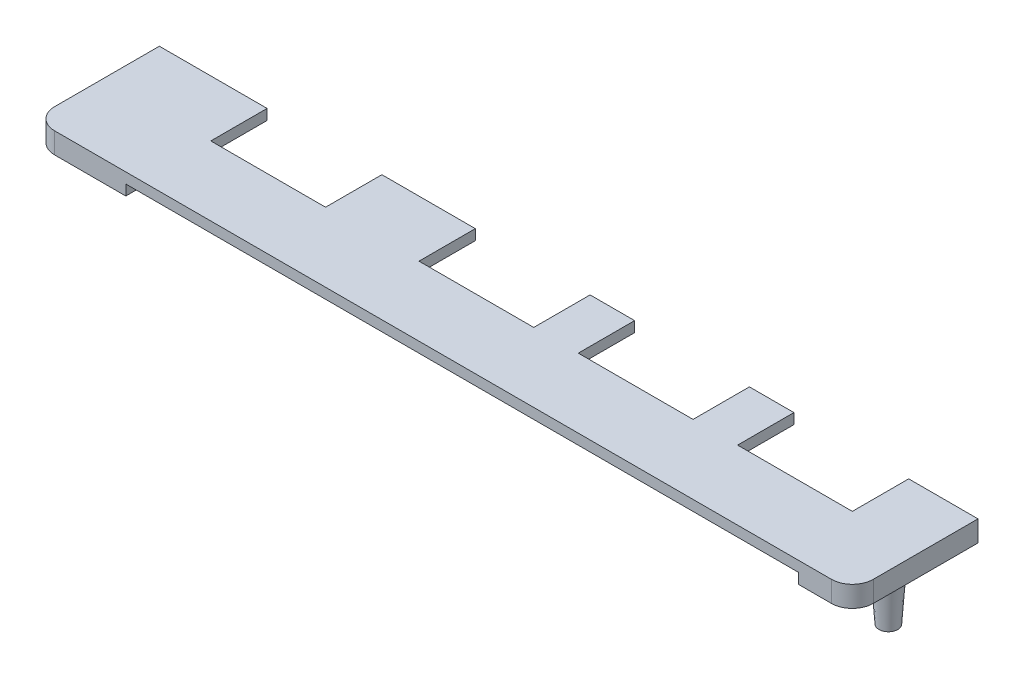
ISO-10303-21;
HEADER;
FILE_DESCRIPTION(('STEP AP214'),'2;1');
FILE_NAME('part.step','',(''),(''),'','','');
FILE_SCHEMA(('AUTOMOTIVE_DESIGN { 1 0 10303 214 1 1 1 1 }'));
ENDSEC;
DATA;
#1=APPLICATION_CONTEXT('core data for automotive mechanical design processes');
#2=APPLICATION_PROTOCOL_DEFINITION('international standard','automotive_design',2000,#1);
#3=PRODUCT_CONTEXT('',#1,'mechanical');
#4=PRODUCT('Part','Part','',(#3));
#5=PRODUCT_RELATED_PRODUCT_CATEGORY('part','',(#4));
#6=PRODUCT_DEFINITION_FORMATION('','',#4);
#7=PRODUCT_DEFINITION_CONTEXT('part definition',#1,'design');
#8=PRODUCT_DEFINITION('design','',#6,#7);
#9=PRODUCT_DEFINITION_SHAPE('','',#8);
#10=(LENGTH_UNIT() NAMED_UNIT(*) SI_UNIT(.MILLI.,.METRE.));
#11=(NAMED_UNIT(*) PLANE_ANGLE_UNIT() SI_UNIT($,.RADIAN.));
#12=(NAMED_UNIT(*) SI_UNIT($,.STERADIAN.) SOLID_ANGLE_UNIT());
#13=UNCERTAINTY_MEASURE_WITH_UNIT(LENGTH_MEASURE(1.E-05),#10,'distance_accuracy_value','');
#14=(GEOMETRIC_REPRESENTATION_CONTEXT(3) GLOBAL_UNCERTAINTY_ASSIGNED_CONTEXT((#13)) GLOBAL_UNIT_ASSIGNED_CONTEXT((#10,
#11,#12)) REPRESENTATION_CONTEXT('',''));
#15=CARTESIAN_POINT('',(0.,0.,0.));
#16=DIRECTION('',(0.,0.,1.));
#17=DIRECTION('',(1.,0.,0.));
#18=AXIS2_PLACEMENT_3D('',#15,#16,#17);
#19=CARTESIAN_POINT('',(0.,1.27,26.3271));
#20=DIRECTION('',(0.,0.,-1.));
#21=DIRECTION('',(-1.,0.,0.));
#22=AXIS2_PLACEMENT_3D('',#19,#20,#21);
#23=PLANE('',#22);
#24=DIRECTION('',(1.,0.,0.));
#25=VECTOR('',#24,1.);
#26=CARTESIAN_POINT('',(0.,0.,26.3271));
#27=LINE('',#26,#25);
#28=CARTESIAN_POINT('',(-36.6395000000001,0.,26.3271));
#29=VERTEX_POINT('',#28);
#30=CARTESIAN_POINT('',(-22.6949000000001,0.,26.3271));
#31=VERTEX_POINT('',#30);
#32=EDGE_CURVE('E310',#29,#31,#27,.T.);
#33=ORIENTED_EDGE('',*,*,#32,.F.);
#34=DIRECTION('',(0.,-1.,0.));
#35=VECTOR('',#34,1.);
#36=CARTESIAN_POINT('',(-36.6395000000001,1.27,26.3271));
#37=LINE('',#36,#35);
#38=CARTESIAN_POINT('',(-36.6395000000001,1.27,26.3271));
#39=VERTEX_POINT('',#38);
#40=EDGE_CURVE('E264',#39,#29,#37,.T.);
#41=ORIENTED_EDGE('',*,*,#40,.F.);
#42=DIRECTION('',(1.,0.,0.));
#43=VECTOR('',#42,1.);
#44=CARTESIAN_POINT('',(0.,1.27,26.3271));
#45=LINE('',#44,#43);
#46=CARTESIAN_POINT('',(-22.6949000000001,1.27,26.3271));
#47=VERTEX_POINT('',#46);
#48=EDGE_CURVE('E263',#39,#47,#45,.T.);
#49=ORIENTED_EDGE('',*,*,#48,.T.);
#50=DIRECTION('',(0.,-1.,0.));
#51=VECTOR('',#50,1.);
#52=CARTESIAN_POINT('',(-22.6949000000001,1.27,26.3271));
#53=LINE('',#52,#51);
#54=EDGE_CURVE('E260',#47,#31,#53,.T.);
#55=ORIENTED_EDGE('',*,*,#54,.T.);
#56=EDGE_LOOP('',(#33,#41,#49,#55));
#57=FACE_BOUND('',#56,.T.);
#58=ADVANCED_FACE('F34',(#57),#23,.T.);
#59=CARTESIAN_POINT('',(0.,1.27,26.3271));
#60=DIRECTION('',(0.,0.,-1.));
#61=DIRECTION('',(-1.,0.,0.));
#62=AXIS2_PLACEMENT_3D('',#59,#60,#61);
#63=PLANE('',#62);
#64=DIRECTION('',(1.,0.,0.));
#65=VECTOR('',#64,1.);
#66=CARTESIAN_POINT('',(0.,0.,26.3271));
#67=LINE('',#66,#65);
#68=CARTESIAN_POINT('',(-11.3411,0.,26.3271));
#69=VERTEX_POINT('',#68);
#70=CARTESIAN_POINT('',(2.60350000000001,0.,26.3271));
#71=VERTEX_POINT('',#70);
#72=EDGE_CURVE('E304',#69,#71,#67,.T.);
#73=ORIENTED_EDGE('',*,*,#72,.F.);
#74=DIRECTION('',(0.,-1.,0.));
#75=VECTOR('',#74,1.);
#76=CARTESIAN_POINT('',(-11.3411,1.27,26.3271));
#77=LINE('',#76,#75);
#78=CARTESIAN_POINT('',(-11.3411,1.27,26.3271));
#79=VERTEX_POINT('',#78);
#80=EDGE_CURVE('E272',#79,#69,#77,.T.);
#81=ORIENTED_EDGE('',*,*,#80,.F.);
#82=DIRECTION('',(1.,0.,0.));
#83=VECTOR('',#82,1.);
#84=CARTESIAN_POINT('',(0.,1.27,26.3271));
#85=LINE('',#84,#83);
#86=CARTESIAN_POINT('',(2.60350000000001,1.27,26.3271));
#87=VERTEX_POINT('',#86);
#88=EDGE_CURVE('E271',#79,#87,#85,.T.);
#89=ORIENTED_EDGE('',*,*,#88,.T.);
#90=DIRECTION('',(0.,-1.,0.));
#91=VECTOR('',#90,1.);
#92=CARTESIAN_POINT('',(2.60350000000001,1.27,26.3271));
#93=LINE('',#92,#91);
#94=EDGE_CURVE('E267',#87,#71,#93,.T.);
#95=ORIENTED_EDGE('',*,*,#94,.T.);
#96=EDGE_LOOP('',(#73,#81,#89,#95));
#97=FACE_BOUND('',#96,.T.);
#98=ADVANCED_FACE('F473',(#97),#63,.T.);
#99=CARTESIAN_POINT('',(0.,1.27,26.3271));
#100=DIRECTION('',(0.,0.,-1.));
#101=DIRECTION('',(-1.,0.,0.));
#102=AXIS2_PLACEMENT_3D('',#99,#100,#101);
#103=PLANE('',#102);
#104=DIRECTION('',(1.,0.,0.));
#105=VECTOR('',#104,1.);
#106=CARTESIAN_POINT('',(0.,0.,26.3271));
#107=LINE('',#106,#105);
#108=CARTESIAN_POINT('',(8.01369999999999,0.,26.3271));
#109=VERTEX_POINT('',#108);
#110=CARTESIAN_POINT('',(21.9583,0.,26.3271));
#111=VERTEX_POINT('',#110);
#112=EDGE_CURVE('E297',#109,#111,#107,.T.);
#113=ORIENTED_EDGE('',*,*,#112,.F.);
#114=DIRECTION('',(0.,-1.,0.));
#115=VECTOR('',#114,1.);
#116=CARTESIAN_POINT('',(8.01369999999999,1.27,26.3271));
#117=LINE('',#116,#115);
#118=CARTESIAN_POINT('',(8.01369999999999,1.27,26.3271));
#119=VERTEX_POINT('',#118);
#120=EDGE_CURVE('E281',#119,#109,#117,.T.);
#121=ORIENTED_EDGE('',*,*,#120,.F.);
#122=DIRECTION('',(1.,0.,0.));
#123=VECTOR('',#122,1.);
#124=CARTESIAN_POINT('',(0.,1.27,26.3271));
#125=LINE('',#124,#123);
#126=CARTESIAN_POINT('',(21.9583,1.27,26.3271));
#127=VERTEX_POINT('',#126);
#128=EDGE_CURVE('E280',#119,#127,#125,.T.);
#129=ORIENTED_EDGE('',*,*,#128,.T.);
#130=DIRECTION('',(0.,-1.,0.));
#131=VECTOR('',#130,1.);
#132=CARTESIAN_POINT('',(21.9583,1.27,26.3271));
#133=LINE('',#132,#131);
#134=EDGE_CURVE('E276',#127,#111,#133,.T.);
#135=ORIENTED_EDGE('',*,*,#134,.T.);
#136=EDGE_LOOP('',(#113,#121,#129,#135));
#137=FACE_BOUND('',#136,.T.);
#138=ADVANCED_FACE('F442',(#137),#103,.T.);
#139=CARTESIAN_POINT('',(0.,1.27,26.3271));
#140=DIRECTION('',(0.,0.,-1.));
#141=DIRECTION('',(-1.,0.,0.));
#142=AXIS2_PLACEMENT_3D('',#139,#140,#141);
#143=PLANE('',#142);
#144=DIRECTION('',(1.,0.,0.));
#145=VECTOR('',#144,1.);
#146=CARTESIAN_POINT('',(0.,0.,26.3271));
#147=LINE('',#146,#145);
#148=CARTESIAN_POINT('',(27.3685,0.,26.3271));
#149=VERTEX_POINT('',#148);
#150=CARTESIAN_POINT('',(41.3131,0.,26.3271));
#151=VERTEX_POINT('',#150);
#152=EDGE_CURVE('E296',#149,#151,#147,.T.);
#153=ORIENTED_EDGE('',*,*,#152,.F.);
#154=DIRECTION('',(0.,-1.,0.));
#155=VECTOR('',#154,1.);
#156=CARTESIAN_POINT('',(27.3685,1.27,26.3271));
#157=LINE('',#156,#155);
#158=CARTESIAN_POINT('',(27.3685,1.27,26.3271));
#159=VERTEX_POINT('',#158);
#160=EDGE_CURVE('E289',#159,#149,#157,.T.);
#161=ORIENTED_EDGE('',*,*,#160,.F.);
#162=DIRECTION('',(1.,0.,0.));
#163=VECTOR('',#162,1.);
#164=CARTESIAN_POINT('',(0.,1.27,26.3271));
#165=LINE('',#164,#163);
#166=CARTESIAN_POINT('',(41.3131,1.27,26.3271));
#167=VERTEX_POINT('',#166);
#168=EDGE_CURVE('E288',#159,#167,#165,.T.);
#169=ORIENTED_EDGE('',*,*,#168,.T.);
#170=DIRECTION('',(0.,-1.,0.));
#171=VECTOR('',#170,1.);
#172=CARTESIAN_POINT('',(41.3131,1.27,26.3271));
#173=LINE('',#172,#171);
#174=EDGE_CURVE('E284',#167,#151,#173,.T.);
#175=ORIENTED_EDGE('',*,*,#174,.T.);
#176=EDGE_LOOP('',(#153,#161,#169,#175));
#177=FACE_BOUND('',#176,.T.);
#178=ADVANCED_FACE('F500',(#177),#143,.T.);
#179=CARTESIAN_POINT('',(0.,1.27,34.7472));
#180=DIRECTION('',(0.,0.,-1.));
#181=DIRECTION('',(-1.,0.,0.));
#182=AXIS2_PLACEMENT_3D('',#179,#180,#181);
#183=PLANE('',#182);
#184=DIRECTION('',(-1.,0.,0.));
#185=VECTOR('',#184,1.);
#186=CARTESIAN_POINT('',(43.2181,-1.27,34.7472));
#187=LINE('',#186,#185);
#188=CARTESIAN_POINT('',(47.1932000000001,-1.27,34.7472));
#189=VERTEX_POINT('',#188);
#190=CARTESIAN_POINT('',(43.2181,-1.27,34.7472));
#191=VERTEX_POINT('',#190);
#192=EDGE_CURVE('E358',#189,#191,#187,.T.);
#193=ORIENTED_EDGE('',*,*,#192,.F.);
#194=DIRECTION('',(0.,-1.,0.));
#195=VECTOR('',#194,1.);
#196=CARTESIAN_POINT('',(47.1932000000001,1.27,34.7472));
#197=LINE('',#196,#195);
#198=CARTESIAN_POINT('',(47.1932000000001,1.27,34.7472));
#199=VERTEX_POINT('',#198);
#200=EDGE_CURVE('E381',#189,#199,#197,.F.);
#201=ORIENTED_EDGE('',*,*,#200,.T.);
#202=DIRECTION('',(1.,0.,0.));
#203=VECTOR('',#202,1.);
#204=CARTESIAN_POINT('',(0.,1.27,34.7472));
#205=LINE('',#204,#203);
#206=CARTESIAN_POINT('',(-47.1932,1.27,34.7472));
#207=VERTEX_POINT('',#206);
#208=EDGE_CURVE('E292',#207,#199,#205,.T.);
#209=ORIENTED_EDGE('',*,*,#208,.F.);
#210=DIRECTION('',(0.,-1.,0.));
#211=VECTOR('',#210,1.);
#212=CARTESIAN_POINT('',(-47.1932,-1.27,34.7472));
#213=LINE('',#212,#211);
#214=CARTESIAN_POINT('',(-47.1932,-1.27,34.7472));
#215=VERTEX_POINT('',#214);
#216=EDGE_CURVE('E378',#207,#215,#213,.T.);
#217=ORIENTED_EDGE('',*,*,#216,.T.);
#218=DIRECTION('',(-1.,0.,0.));
#219=VECTOR('',#218,1.);
#220=CARTESIAN_POINT('',(-49.7332,-1.27,34.7472));
#221=LINE('',#220,#219);
#222=CARTESIAN_POINT('',(-38.5445000000001,-1.27,34.7472));
#223=VERTEX_POINT('',#222);
#224=EDGE_CURVE('E209',#223,#215,#221,.T.);
#225=ORIENTED_EDGE('',*,*,#224,.F.);
#226=DIRECTION('',(0.,1.,0.));
#227=VECTOR('',#226,1.);
#228=CARTESIAN_POINT('',(-38.5445000000001,-1.27,34.7472));
#229=LINE('',#228,#227);
#230=CARTESIAN_POINT('',(-38.5445000000001,0.,34.7472));
#231=VERTEX_POINT('',#230);
#232=EDGE_CURVE('E270',#223,#231,#229,.T.);
#233=ORIENTED_EDGE('',*,*,#232,.T.);
#234=DIRECTION('',(1.,0.,0.));
#235=VECTOR('',#234,1.);
#236=CARTESIAN_POINT('',(0.,0.,34.7472));
#237=LINE('',#236,#235);
#238=CARTESIAN_POINT('',(43.2181,0.,34.7472));
#239=VERTEX_POINT('',#238);
#240=EDGE_CURVE('E314',#231,#239,#237,.T.);
#241=ORIENTED_EDGE('',*,*,#240,.T.);
#242=DIRECTION('',(0.,1.,0.));
#243=VECTOR('',#242,1.);
#244=CARTESIAN_POINT('',(43.2181,-1.27,34.7472));
#245=LINE('',#244,#243);
#246=EDGE_CURVE('E354',#191,#239,#245,.T.);
#247=ORIENTED_EDGE('',*,*,#246,.F.);
#248=EDGE_LOOP('',(#193,#201,#209,#217,#225,#233,#241,#247));
#249=FACE_BOUND('',#248,.T.);
#250=ADVANCED_FACE('F406',(#249),#183,.F.);
#251=CARTESIAN_POINT('',(0.,1.27,0.));
#252=DIRECTION('',(0.,1.,0.));
#253=DIRECTION('',(0.,0.,1.));
#254=AXIS2_PLACEMENT_3D('',#251,#252,#253);
#255=PLANE('',#254);
#256=ORIENTED_EDGE('',*,*,#208,.T.);
#257=CARTESIAN_POINT('',(47.1932000000001,1.27,32.2072));
#258=DIRECTION('',(0.,1.,0.));
#259=DIRECTION('',(0.,0.,1.));
#260=AXIS2_PLACEMENT_3D('',#257,#258,#259);
#261=CIRCLE('',#260,2.54);
#262=CARTESIAN_POINT('',(49.7332000000001,1.27,32.2072));
#263=VERTEX_POINT('',#262);
#264=EDGE_CURVE('E385',#199,#263,#261,.T.);
#265=ORIENTED_EDGE('',*,*,#264,.T.);
#266=DIRECTION('',(0.,0.,-1.));
#267=VECTOR('',#266,1.);
#268=CARTESIAN_POINT('',(49.7332000000001,1.27,0.));
#269=LINE('',#268,#267);
#270=CARTESIAN_POINT('',(49.7332000000001,1.27,19.4818));
#271=VERTEX_POINT('',#270);
#272=EDGE_CURVE('E343',#263,#271,#269,.T.);
#273=ORIENTED_EDGE('',*,*,#272,.T.);
#274=DIRECTION('',(1.,0.,0.));
#275=VECTOR('',#274,1.);
#276=CARTESIAN_POINT('',(-49.7332,1.27,19.4818));
#277=LINE('',#276,#275);
#278=CARTESIAN_POINT('',(41.3131,1.27,19.4818));
#279=VERTEX_POINT('',#278);
#280=EDGE_CURVE('E413',#279,#271,#277,.T.);
#281=ORIENTED_EDGE('',*,*,#280,.F.);
#282=DIRECTION('',(0.,0.,1.));
#283=VECTOR('',#282,1.);
#284=CARTESIAN_POINT('',(41.3131,1.27,0.));
#285=LINE('',#284,#283);
#286=EDGE_CURVE('E327',#279,#167,#285,.T.);
#287=ORIENTED_EDGE('',*,*,#286,.T.);
#288=ORIENTED_EDGE('',*,*,#168,.F.);
#289=DIRECTION('',(0.,0.,1.));
#290=VECTOR('',#289,1.);
#291=CARTESIAN_POINT('',(27.3685,1.27,0.));
#292=LINE('',#291,#290);
#293=CARTESIAN_POINT('',(27.3685,1.27,19.4818));
#294=VERTEX_POINT('',#293);
#295=EDGE_CURVE('E293',#294,#159,#292,.T.);
#296=ORIENTED_EDGE('',*,*,#295,.F.);
#297=CARTESIAN_POINT('',(21.9583,1.27,19.4818));
#298=VERTEX_POINT('',#297);
#299=EDGE_CURVE('E415',#298,#294,#277,.T.);
#300=ORIENTED_EDGE('',*,*,#299,.F.);
#301=DIRECTION('',(0.,0.,1.));
#302=VECTOR('',#301,1.);
#303=CARTESIAN_POINT('',(21.9583,1.27,0.));
#304=LINE('',#303,#302);
#305=EDGE_CURVE('E330',#298,#127,#304,.T.);
#306=ORIENTED_EDGE('',*,*,#305,.T.);
#307=ORIENTED_EDGE('',*,*,#128,.F.);
#308=DIRECTION('',(0.,0.,1.));
#309=VECTOR('',#308,1.);
#310=CARTESIAN_POINT('',(8.01369999999998,1.27,0.));
#311=LINE('',#310,#309);
#312=CARTESIAN_POINT('',(8.01369999999998,1.27,19.4818));
#313=VERTEX_POINT('',#312);
#314=EDGE_CURVE('E266',#313,#119,#311,.T.);
#315=ORIENTED_EDGE('',*,*,#314,.F.);
#316=CARTESIAN_POINT('',(2.60350000000001,1.27,19.4818));
#317=VERTEX_POINT('',#316);
#318=EDGE_CURVE('E417',#317,#313,#277,.T.);
#319=ORIENTED_EDGE('',*,*,#318,.F.);
#320=DIRECTION('',(0.,0.,1.));
#321=VECTOR('',#320,1.);
#322=CARTESIAN_POINT('',(2.6035,1.27,0.));
#323=LINE('',#322,#321);
#324=EDGE_CURVE('E335',#317,#87,#323,.T.);
#325=ORIENTED_EDGE('',*,*,#324,.T.);
#326=ORIENTED_EDGE('',*,*,#88,.F.);
#327=DIRECTION('',(0.,0.,1.));
#328=VECTOR('',#327,1.);
#329=CARTESIAN_POINT('',(-11.3411,1.27,0.));
#330=LINE('',#329,#328);
#331=CARTESIAN_POINT('',(-11.3411,1.27,19.4818));
#332=VERTEX_POINT('',#331);
#333=EDGE_CURVE('E275',#332,#79,#330,.T.);
#334=ORIENTED_EDGE('',*,*,#333,.F.);
#335=CARTESIAN_POINT('',(-22.6949000000001,1.27,19.4818));
#336=VERTEX_POINT('',#335);
#337=EDGE_CURVE('E421',#336,#332,#277,.T.);
#338=ORIENTED_EDGE('',*,*,#337,.F.);
#339=DIRECTION('',(0.,0.,-1.));
#340=VECTOR('',#339,1.);
#341=CARTESIAN_POINT('',(-22.6949000000001,1.27,0.));
#342=LINE('',#341,#340);
#343=EDGE_CURVE('E317',#47,#336,#342,.T.);
#344=ORIENTED_EDGE('',*,*,#343,.F.);
#345=ORIENTED_EDGE('',*,*,#48,.F.);
#346=DIRECTION('',(0.,0.,-1.));
#347=VECTOR('',#346,1.);
#348=CARTESIAN_POINT('',(-36.6395000000001,1.27,0.));
#349=LINE('',#348,#347);
#350=CARTESIAN_POINT('',(-36.6395000000001,1.27,19.4818));
#351=VERTEX_POINT('',#350);
#352=EDGE_CURVE('E340',#39,#351,#349,.T.);
#353=ORIENTED_EDGE('',*,*,#352,.T.);
#354=CARTESIAN_POINT('',(-49.7332,1.27,19.4818));
#355=VERTEX_POINT('',#354);
#356=EDGE_CURVE('E219',#355,#351,#277,.T.);
#357=ORIENTED_EDGE('',*,*,#356,.F.);
#358=DIRECTION('',(0.,0.,-1.));
#359=VECTOR('',#358,1.);
#360=CARTESIAN_POINT('',(-49.7332,1.27,0.));
#361=LINE('',#360,#359);
#362=CARTESIAN_POINT('',(-49.7332,1.27,32.2072));
#363=VERTEX_POINT('',#362);
#364=EDGE_CURVE('E222',#363,#355,#361,.T.);
#365=ORIENTED_EDGE('',*,*,#364,.F.);
#366=CARTESIAN_POINT('',(-47.1932,1.27,32.2072));
#367=DIRECTION('',(0.,1.,0.));
#368=DIRECTION('',(0.,0.,1.));
#369=AXIS2_PLACEMENT_3D('',#366,#367,#368);
#370=CIRCLE('',#369,2.54);
#371=EDGE_CURVE('E383',#363,#207,#370,.T.);
#372=ORIENTED_EDGE('',*,*,#371,.T.);
#373=EDGE_LOOP('',(#256,#265,#273,#281,#287,#288,#296,#300,#306,#307,#315,#319,#325,#326,#334,
#338,#344,#345,#353,#357,#365,#372));
#374=FACE_BOUND('',#373,.T.);
#375=ADVANCED_FACE('F389',(#374),#255,.T.);
#376=CARTESIAN_POINT('',(27.3685,1.27,0.));
#377=DIRECTION('',(1.,0.,0.));
#378=DIRECTION('',(0.,0.,-1.));
#379=AXIS2_PLACEMENT_3D('',#376,#377,#378);
#380=PLANE('',#379);
#381=DIRECTION('',(0.,-1.,0.));
#382=VECTOR('',#381,1.);
#383=CARTESIAN_POINT('',(27.3685,1.27,19.4818));
#384=LINE('',#383,#382);
#385=CARTESIAN_POINT('',(27.3685,0.,19.4818));
#386=VERTEX_POINT('',#385);
#387=EDGE_CURVE('E243',#294,#386,#384,.T.);
#388=ORIENTED_EDGE('',*,*,#387,.F.);
#389=ORIENTED_EDGE('',*,*,#295,.T.);
#390=ORIENTED_EDGE('',*,*,#160,.T.);
#391=DIRECTION('',(0.,0.,1.));
#392=VECTOR('',#391,1.);
#393=CARTESIAN_POINT('',(27.3685,0.,0.));
#394=LINE('',#393,#392);
#395=EDGE_CURVE('E294',#386,#149,#394,.T.);
#396=ORIENTED_EDGE('',*,*,#395,.F.);
#397=EDGE_LOOP('',(#388,#389,#390,#396));
#398=FACE_BOUND('',#397,.T.);
#399=ADVANCED_FACE('F505',(#398),#380,.T.);
#400=CARTESIAN_POINT('',(0.,-1.27,0.));
#401=DIRECTION('',(0.,-1.,0.));
#402=DIRECTION('',(0.,0.,-1.));
#403=AXIS2_PLACEMENT_3D('',#400,#401,#402);
#404=PLANE('',#403);
#405=CARTESIAN_POINT('',(-46.4756500000001,-1.27,27.1145));
#406=DIRECTION('',(0.,-1.,0.));
#407=DIRECTION('',(0.,0.,1.));
#408=AXIS2_PLACEMENT_3D('',#405,#406,#407);
#409=CIRCLE('',#408,1.5875);
#410=CARTESIAN_POINT('',(-46.4756500000001,-1.27,28.702));
#411=VERTEX_POINT('',#410);
#412=EDGE_CURVE('E776',#411,#411,#409,.T.);
#413=ORIENTED_EDGE('',*,*,#412,.F.);
#414=EDGE_LOOP('',(#413));
#415=FACE_BOUND('',#414,.T.);
#416=ORIENTED_EDGE('',*,*,#224,.T.);
#417=CARTESIAN_POINT('',(-47.1932,-1.27,32.2072));
#418=DIRECTION('',(0.,-1.,0.));
#419=DIRECTION('',(0.,0.,-1.));
#420=AXIS2_PLACEMENT_3D('',#417,#418,#419);
#421=CIRCLE('',#420,2.54);
#422=CARTESIAN_POINT('',(-49.7332,-1.27,32.2072));
#423=VERTEX_POINT('',#422);
#424=EDGE_CURVE('E42',#215,#423,#421,.T.);
#425=ORIENTED_EDGE('',*,*,#424,.T.);
#426=DIRECTION('',(0.,0.,-1.));
#427=VECTOR('',#426,1.);
#428=CARTESIAN_POINT('',(-49.7332,-1.27,34.7472));
#429=LINE('',#428,#427);
#430=CARTESIAN_POINT('',(-49.7332,-1.27,19.4818));
#431=VERTEX_POINT('',#430);
#432=EDGE_CURVE('E202',#423,#431,#429,.T.);
#433=ORIENTED_EDGE('',*,*,#432,.T.);
#434=DIRECTION('',(1.,0.,0.));
#435=VECTOR('',#434,1.);
#436=CARTESIAN_POINT('',(-49.7332,-1.27,19.4818));
#437=LINE('',#436,#435);
#438=CARTESIAN_POINT('',(-38.5445000000001,-1.27,19.4818));
#439=VERTEX_POINT('',#438);
#440=EDGE_CURVE('E205',#431,#439,#437,.T.);
#441=ORIENTED_EDGE('',*,*,#440,.T.);
#442=DIRECTION('',(0.,0.,1.));
#443=VECTOR('',#442,1.);
#444=CARTESIAN_POINT('',(-38.5445000000001,-1.27,34.7472));
#445=LINE('',#444,#443);
#446=EDGE_CURVE('E353',#439,#223,#445,.T.);
#447=ORIENTED_EDGE('',*,*,#446,.T.);
#448=EDGE_LOOP('',(#416,#425,#433,#441,#447));
#449=FACE_BOUND('',#448,.T.);
#450=ADVANCED_FACE('F204',(#415,#449),#404,.T.);
#451=CARTESIAN_POINT('',(-38.5445000000001,-1.27,34.7472));
#452=DIRECTION('',(-1.,0.,0.));
#453=DIRECTION('',(0.,0.,1.));
#454=AXIS2_PLACEMENT_3D('',#451,#452,#453);
#455=PLANE('',#454);
#456=ORIENTED_EDGE('',*,*,#446,.F.);
#457=DIRECTION('',(0.,1.,0.));
#458=VECTOR('',#457,1.);
#459=CARTESIAN_POINT('',(-38.5445000000001,-1.27,19.4818));
#460=LINE('',#459,#458);
#461=CARTESIAN_POINT('',(-38.5445000000001,0.,19.4818));
#462=VERTEX_POINT('',#461);
#463=EDGE_CURVE('E217',#439,#462,#460,.T.);
#464=ORIENTED_EDGE('',*,*,#463,.T.);
#465=DIRECTION('',(0.,0.,1.));
#466=VECTOR('',#465,1.);
#467=CARTESIAN_POINT('',(-38.5445000000001,0.,34.7472));
#468=LINE('',#467,#466);
#469=EDGE_CURVE('E329',#462,#231,#468,.T.);
#470=ORIENTED_EDGE('',*,*,#469,.T.);
#471=ORIENTED_EDGE('',*,*,#232,.F.);
#472=EDGE_LOOP('',(#456,#464,#470,#471));
#473=FACE_BOUND('',#472,.T.);
#474=ADVANCED_FACE('F522',(#473),#455,.F.);
#475=CARTESIAN_POINT('',(-49.7332,1.27,0.));
#476=DIRECTION('',(-1.,0.,0.));
#477=DIRECTION('',(0.,0.,1.));
#478=AXIS2_PLACEMENT_3D('',#475,#476,#477);
#479=PLANE('',#478);
#480=ORIENTED_EDGE('',*,*,#432,.F.);
#481=DIRECTION('',(0.,-1.,0.));
#482=VECTOR('',#481,1.);
#483=CARTESIAN_POINT('',(-49.7332,1.27,32.2072));
#484=LINE('',#483,#482);
#485=EDGE_CURVE('E11',#423,#363,#484,.F.);
#486=ORIENTED_EDGE('',*,*,#485,.T.);
#487=ORIENTED_EDGE('',*,*,#364,.T.);
#488=DIRECTION('',(0.,1.,0.));
#489=VECTOR('',#488,1.);
#490=CARTESIAN_POINT('',(-49.7332,-1.27,19.4818));
#491=LINE('',#490,#489);
#492=EDGE_CURVE('E214',#431,#355,#491,.T.);
#493=ORIENTED_EDGE('',*,*,#492,.F.);
#494=EDGE_LOOP('',(#480,#486,#487,#493));
#495=FACE_BOUND('',#494,.T.);
#496=ADVANCED_FACE('F221',(#495),#479,.T.);
#497=CARTESIAN_POINT('',(-11.3411,1.27,0.));
#498=DIRECTION('',(1.,0.,0.));
#499=DIRECTION('',(0.,0.,-1.));
#500=AXIS2_PLACEMENT_3D('',#497,#498,#499);
#501=PLANE('',#500);
#502=DIRECTION('',(0.,-1.,0.));
#503=VECTOR('',#502,1.);
#504=CARTESIAN_POINT('',(-11.3411,1.27,19.4818));
#505=LINE('',#504,#503);
#506=CARTESIAN_POINT('',(-11.3411,0.,19.4818));
#507=VERTEX_POINT('',#506);
#508=EDGE_CURVE('E249',#332,#507,#505,.T.);
#509=ORIENTED_EDGE('',*,*,#508,.F.);
#510=ORIENTED_EDGE('',*,*,#333,.T.);
#511=ORIENTED_EDGE('',*,*,#80,.T.);
#512=DIRECTION('',(0.,0.,1.));
#513=VECTOR('',#512,1.);
#514=CARTESIAN_POINT('',(-11.3411,0.,0.));
#515=LINE('',#514,#513);
#516=EDGE_CURVE('E308',#507,#69,#515,.T.);
#517=ORIENTED_EDGE('',*,*,#516,.F.);
#518=EDGE_LOOP('',(#509,#510,#511,#517));
#519=FACE_BOUND('',#518,.T.);
#520=ADVANCED_FACE('F470',(#519),#501,.T.);
#521=CARTESIAN_POINT('',(8.01369999999998,1.27,0.));
#522=DIRECTION('',(1.,0.,0.));
#523=DIRECTION('',(0.,0.,-1.));
#524=AXIS2_PLACEMENT_3D('',#521,#522,#523);
#525=PLANE('',#524);
#526=DIRECTION('',(0.,-1.,0.));
#527=VECTOR('',#526,1.);
#528=CARTESIAN_POINT('',(8.01369999999999,1.27,19.4818));
#529=LINE('',#528,#527);
#530=CARTESIAN_POINT('',(8.01369999999999,0.,19.4818));
#531=VERTEX_POINT('',#530);
#532=EDGE_CURVE('E254',#313,#531,#529,.T.);
#533=ORIENTED_EDGE('',*,*,#532,.F.);
#534=ORIENTED_EDGE('',*,*,#314,.T.);
#535=ORIENTED_EDGE('',*,*,#120,.T.);
#536=DIRECTION('',(0.,0.,1.));
#537=VECTOR('',#536,1.);
#538=CARTESIAN_POINT('',(8.01369999999998,0.,0.));
#539=LINE('',#538,#537);
#540=EDGE_CURVE('E302',#531,#109,#539,.T.);
#541=ORIENTED_EDGE('',*,*,#540,.F.);
#542=EDGE_LOOP('',(#533,#534,#535,#541));
#543=FACE_BOUND('',#542,.T.);
#544=ADVANCED_FACE('F434',(#543),#525,.T.);
#545=CARTESIAN_POINT('',(-36.6395000000001,1.27,0.));
#546=DIRECTION('',(-1.,0.,0.));
#547=DIRECTION('',(0.,0.,1.));
#548=AXIS2_PLACEMENT_3D('',#545,#546,#547);
#549=PLANE('',#548);
#550=DIRECTION('',(0.,0.,-1.));
#551=VECTOR('',#550,1.);
#552=CARTESIAN_POINT('',(-36.6395000000001,0.,0.));
#553=LINE('',#552,#551);
#554=CARTESIAN_POINT('',(-36.6395000000001,0.,19.4818));
#555=VERTEX_POINT('',#554);
#556=EDGE_CURVE('E262',#29,#555,#553,.T.);
#557=ORIENTED_EDGE('',*,*,#556,.T.);
#558=DIRECTION('',(0.,1.,0.));
#559=VECTOR('',#558,1.);
#560=CARTESIAN_POINT('',(-36.6395000000001,1.27,19.4818));
#561=LINE('',#560,#559);
#562=EDGE_CURVE('E240',#555,#351,#561,.T.);
#563=ORIENTED_EDGE('',*,*,#562,.T.);
#564=ORIENTED_EDGE('',*,*,#352,.F.);
#565=ORIENTED_EDGE('',*,*,#40,.T.);
#566=EDGE_LOOP('',(#557,#563,#564,#565));
#567=FACE_BOUND('',#566,.T.);
#568=ADVANCED_FACE('F456',(#567),#549,.F.);
#569=CARTESIAN_POINT('',(-22.6949000000001,1.27,0.));
#570=DIRECTION('',(-1.,0.,0.));
#571=DIRECTION('',(0.,0.,1.));
#572=AXIS2_PLACEMENT_3D('',#569,#570,#571);
#573=PLANE('',#572);
#574=DIRECTION('',(0.,1.,0.));
#575=VECTOR('',#574,1.);
#576=CARTESIAN_POINT('',(-22.6949000000001,1.27,19.4818));
#577=LINE('',#576,#575);
#578=CARTESIAN_POINT('',(-22.6949000000001,0.,19.4818));
#579=VERTEX_POINT('',#578);
#580=EDGE_CURVE('E252',#579,#336,#577,.T.);
#581=ORIENTED_EDGE('',*,*,#580,.F.);
#582=DIRECTION('',(0.,0.,-1.));
#583=VECTOR('',#582,1.);
#584=CARTESIAN_POINT('',(-22.6949000000001,0.,0.));
#585=LINE('',#584,#583);
#586=EDGE_CURVE('E259',#31,#579,#585,.T.);
#587=ORIENTED_EDGE('',*,*,#586,.F.);
#588=ORIENTED_EDGE('',*,*,#54,.F.);
#589=ORIENTED_EDGE('',*,*,#343,.T.);
#590=EDGE_LOOP('',(#581,#587,#588,#589));
#591=FACE_BOUND('',#590,.T.);
#592=ADVANCED_FACE('F463',(#591),#573,.T.);
#593=CARTESIAN_POINT('',(0.,-1.27,0.));
#594=DIRECTION('',(0.,-1.,0.));
#595=DIRECTION('',(0.,0.,-1.));
#596=AXIS2_PLACEMENT_3D('',#593,#594,#595);
#597=PLANE('',#596);
#598=CARTESIAN_POINT('',(46.4756500000001,-1.27,27.1145));
#599=DIRECTION('',(0.,-1.,0.));
#600=DIRECTION('',(0.,0.,-1.));
#601=AXIS2_PLACEMENT_3D('',#598,#599,#600);
#602=CIRCLE('',#601,1.5875);
#603=CARTESIAN_POINT('',(46.4756500000001,-1.27,25.527));
#604=VERTEX_POINT('',#603);
#605=EDGE_CURVE('E419',#604,#604,#602,.T.);
#606=ORIENTED_EDGE('',*,*,#605,.F.);
#607=EDGE_LOOP('',(#606));
#608=FACE_BOUND('',#607,.T.);
#609=DIRECTION('',(0.,0.,1.));
#610=VECTOR('',#609,1.);
#611=CARTESIAN_POINT('',(49.7332,-1.27,34.7472));
#612=LINE('',#611,#610);
#613=CARTESIAN_POINT('',(49.7332,-1.27,19.4818));
#614=VERTEX_POINT('',#613);
#615=CARTESIAN_POINT('',(49.7332,-1.27,32.2072));
#616=VERTEX_POINT('',#615);
#617=EDGE_CURVE('E357',#614,#616,#612,.T.);
#618=ORIENTED_EDGE('',*,*,#617,.T.);
#619=CARTESIAN_POINT('',(47.1932000000001,-1.27,32.2072));
#620=DIRECTION('',(0.,-1.,0.));
#621=DIRECTION('',(0.,0.,-1.));
#622=AXIS2_PLACEMENT_3D('',#619,#620,#621);
#623=CIRCLE('',#622,2.54);
#624=EDGE_CURVE('E376',#616,#189,#623,.T.);
#625=ORIENTED_EDGE('',*,*,#624,.T.);
#626=ORIENTED_EDGE('',*,*,#192,.T.);
#627=DIRECTION('',(0.,0.,-1.));
#628=VECTOR('',#627,1.);
#629=CARTESIAN_POINT('',(43.2181,-1.27,34.7472));
#630=LINE('',#629,#628);
#631=CARTESIAN_POINT('',(43.2181,-1.27,19.4818));
#632=VERTEX_POINT('',#631);
#633=EDGE_CURVE('E360',#191,#632,#630,.T.);
#634=ORIENTED_EDGE('',*,*,#633,.T.);
#635=DIRECTION('',(-1.,0.,0.));
#636=VECTOR('',#635,1.);
#637=CARTESIAN_POINT('',(0.,-1.27,19.4818));
#638=LINE('',#637,#636);
#639=EDGE_CURVE('E369',#614,#632,#638,.T.);
#640=ORIENTED_EDGE('',*,*,#639,.F.);
#641=EDGE_LOOP('',(#618,#625,#626,#634,#640));
#642=FACE_BOUND('',#641,.T.);
#643=ADVANCED_FACE('F402',(#608,#642),#597,.T.);
#644=CARTESIAN_POINT('',(43.2181,-1.27,34.7472));
#645=DIRECTION('',(1.,0.,0.));
#646=DIRECTION('',(0.,0.,-1.));
#647=AXIS2_PLACEMENT_3D('',#644,#645,#646);
#648=PLANE('',#647);
#649=DIRECTION('',(0.,0.,-1.));
#650=VECTOR('',#649,1.);
#651=CARTESIAN_POINT('',(43.2181,0.,34.7472));
#652=LINE('',#651,#650);
#653=CARTESIAN_POINT('',(43.2181,0.,19.4818));
#654=VERTEX_POINT('',#653);
#655=EDGE_CURVE('E208',#239,#654,#652,.T.);
#656=ORIENTED_EDGE('',*,*,#655,.T.);
#657=DIRECTION('',(0.,-1.,0.));
#658=VECTOR('',#657,1.);
#659=CARTESIAN_POINT('',(43.2181,-1.27,19.4818));
#660=LINE('',#659,#658);
#661=EDGE_CURVE('E223',#654,#632,#660,.T.);
#662=ORIENTED_EDGE('',*,*,#661,.T.);
#663=ORIENTED_EDGE('',*,*,#633,.F.);
#664=ORIENTED_EDGE('',*,*,#246,.T.);
#665=EDGE_LOOP('',(#656,#662,#663,#664));
#666=FACE_BOUND('',#665,.T.);
#667=ADVANCED_FACE('F410',(#666),#648,.F.);
#668=CARTESIAN_POINT('',(49.7332000000001,1.27,0.));
#669=DIRECTION('',(-1.,0.,0.));
#670=DIRECTION('',(0.,0.,1.));
#671=AXIS2_PLACEMENT_3D('',#668,#669,#670);
#672=PLANE('',#671);
#673=ORIENTED_EDGE('',*,*,#272,.F.);
#674=DIRECTION('',(0.,-1.,0.));
#675=VECTOR('',#674,1.);
#676=CARTESIAN_POINT('',(49.7332000000001,1.27,32.2072));
#677=LINE('',#676,#675);
#678=EDGE_CURVE('E373',#263,#616,#677,.T.);
#679=ORIENTED_EDGE('',*,*,#678,.T.);
#680=ORIENTED_EDGE('',*,*,#617,.F.);
#681=DIRECTION('',(0.,1.,0.));
#682=VECTOR('',#681,1.);
#683=CARTESIAN_POINT('',(49.7332000000001,-1.27,19.4818));
#684=LINE('',#683,#682);
#685=EDGE_CURVE('E218',#614,#271,#684,.T.);
#686=ORIENTED_EDGE('',*,*,#685,.T.);
#687=EDGE_LOOP('',(#673,#679,#680,#686));
#688=FACE_BOUND('',#687,.T.);
#689=ADVANCED_FACE('F397',(#688),#672,.F.);
#690=CARTESIAN_POINT('',(2.6035,1.27,0.));
#691=DIRECTION('',(1.,0.,0.));
#692=DIRECTION('',(0.,0.,-1.));
#693=AXIS2_PLACEMENT_3D('',#690,#691,#692);
#694=PLANE('',#693);
#695=ORIENTED_EDGE('',*,*,#324,.F.);
#696=DIRECTION('',(0.,-1.,0.));
#697=VECTOR('',#696,1.);
#698=CARTESIAN_POINT('',(2.60350000000001,1.27,19.4818));
#699=LINE('',#698,#697);
#700=CARTESIAN_POINT('',(2.60350000000001,0.,19.4818));
#701=VERTEX_POINT('',#700);
#702=EDGE_CURVE('E256',#317,#701,#699,.T.);
#703=ORIENTED_EDGE('',*,*,#702,.T.);
#704=DIRECTION('',(0.,0.,1.));
#705=VECTOR('',#704,1.);
#706=CARTESIAN_POINT('',(2.6035,0.,0.));
#707=LINE('',#706,#705);
#708=EDGE_CURVE('E279',#701,#71,#707,.T.);
#709=ORIENTED_EDGE('',*,*,#708,.T.);
#710=ORIENTED_EDGE('',*,*,#94,.F.);
#711=EDGE_LOOP('',(#695,#703,#709,#710));
#712=FACE_BOUND('',#711,.T.);
#713=ADVANCED_FACE('F476',(#712),#694,.F.);
#714=CARTESIAN_POINT('',(21.9583,1.27,0.));
#715=DIRECTION('',(1.,0.,0.));
#716=DIRECTION('',(0.,0.,-1.));
#717=AXIS2_PLACEMENT_3D('',#714,#715,#716);
#718=PLANE('',#717);
#719=ORIENTED_EDGE('',*,*,#305,.F.);
#720=DIRECTION('',(0.,-1.,0.));
#721=VECTOR('',#720,1.);
#722=CARTESIAN_POINT('',(21.9583,1.27,19.4818));
#723=LINE('',#722,#721);
#724=CARTESIAN_POINT('',(21.9583,0.,19.4818));
#725=VERTEX_POINT('',#724);
#726=EDGE_CURVE('E246',#298,#725,#723,.T.);
#727=ORIENTED_EDGE('',*,*,#726,.T.);
#728=DIRECTION('',(0.,0.,1.));
#729=VECTOR('',#728,1.);
#730=CARTESIAN_POINT('',(21.9583,0.,0.));
#731=LINE('',#730,#729);
#732=EDGE_CURVE('E287',#725,#111,#731,.T.);
#733=ORIENTED_EDGE('',*,*,#732,.T.);
#734=ORIENTED_EDGE('',*,*,#134,.F.);
#735=EDGE_LOOP('',(#719,#727,#733,#734));
#736=FACE_BOUND('',#735,.T.);
#737=ADVANCED_FACE('F478',(#736),#718,.F.);
#738=CARTESIAN_POINT('',(41.3131,1.27,0.));
#739=DIRECTION('',(1.,0.,0.));
#740=DIRECTION('',(0.,0.,-1.));
#741=AXIS2_PLACEMENT_3D('',#738,#739,#740);
#742=PLANE('',#741);
#743=ORIENTED_EDGE('',*,*,#286,.F.);
#744=DIRECTION('',(0.,-1.,0.));
#745=VECTOR('',#744,1.);
#746=CARTESIAN_POINT('',(41.3131,1.27,19.4818));
#747=LINE('',#746,#745);
#748=CARTESIAN_POINT('',(41.3131,0.,19.4818));
#749=VERTEX_POINT('',#748);
#750=EDGE_CURVE('E234',#279,#749,#747,.T.);
#751=ORIENTED_EDGE('',*,*,#750,.T.);
#752=DIRECTION('',(0.,0.,1.));
#753=VECTOR('',#752,1.);
#754=CARTESIAN_POINT('',(41.3131,0.,0.));
#755=LINE('',#754,#753);
#756=EDGE_CURVE('E300',#749,#151,#755,.T.);
#757=ORIENTED_EDGE('',*,*,#756,.T.);
#758=ORIENTED_EDGE('',*,*,#174,.F.);
#759=EDGE_LOOP('',(#743,#751,#757,#758));
#760=FACE_BOUND('',#759,.T.);
#761=ADVANCED_FACE('F484',(#760),#742,.F.);
#762=CARTESIAN_POINT('',(0.,0.,0.));
#763=DIRECTION('',(0.,1.,0.));
#764=DIRECTION('',(0.,0.,1.));
#765=AXIS2_PLACEMENT_3D('',#762,#763,#764);
#766=PLANE('',#765);
#767=ORIENTED_EDGE('',*,*,#469,.F.);
#768=DIRECTION('',(1.,0.,0.));
#769=VECTOR('',#768,1.);
#770=CARTESIAN_POINT('',(0.,0.,19.4818));
#771=LINE('',#770,#769);
#772=EDGE_CURVE('E236',#462,#555,#771,.T.);
#773=ORIENTED_EDGE('',*,*,#772,.T.);
#774=ORIENTED_EDGE('',*,*,#556,.F.);
#775=ORIENTED_EDGE('',*,*,#32,.T.);
#776=ORIENTED_EDGE('',*,*,#586,.T.);
#777=EDGE_CURVE('E251',#579,#507,#771,.T.);
#778=ORIENTED_EDGE('',*,*,#777,.T.);
#779=ORIENTED_EDGE('',*,*,#516,.T.);
#780=ORIENTED_EDGE('',*,*,#72,.T.);
#781=ORIENTED_EDGE('',*,*,#708,.F.);
#782=EDGE_CURVE('E235',#701,#531,#771,.T.);
#783=ORIENTED_EDGE('',*,*,#782,.T.);
#784=ORIENTED_EDGE('',*,*,#540,.T.);
#785=ORIENTED_EDGE('',*,*,#112,.T.);
#786=ORIENTED_EDGE('',*,*,#732,.F.);
#787=EDGE_CURVE('E245',#725,#386,#771,.T.);
#788=ORIENTED_EDGE('',*,*,#787,.T.);
#789=ORIENTED_EDGE('',*,*,#395,.T.);
#790=ORIENTED_EDGE('',*,*,#152,.T.);
#791=ORIENTED_EDGE('',*,*,#756,.F.);
#792=EDGE_CURVE('E226',#749,#654,#771,.T.);
#793=ORIENTED_EDGE('',*,*,#792,.T.);
#794=ORIENTED_EDGE('',*,*,#655,.F.);
#795=ORIENTED_EDGE('',*,*,#240,.F.);
#796=EDGE_LOOP('',(#767,#773,#774,#775,#776,#778,#779,#780,#781,#783,#784,#785,#786,#788,#789,
#790,#791,#793,#794,#795));
#797=FACE_BOUND('',#796,.T.);
#798=ADVANCED_FACE('F446',(#797),#766,.F.);
#799=CARTESIAN_POINT('',(-49.7332,-1.27,19.4818));
#800=DIRECTION('',(0.,0.,1.));
#801=DIRECTION('',(1.,0.,0.));
#802=AXIS2_PLACEMENT_3D('',#799,#800,#801);
#803=PLANE('',#802);
#804=ORIENTED_EDGE('',*,*,#280,.T.);
#805=ORIENTED_EDGE('',*,*,#685,.F.);
#806=ORIENTED_EDGE('',*,*,#639,.T.);
#807=ORIENTED_EDGE('',*,*,#661,.F.);
#808=ORIENTED_EDGE('',*,*,#792,.F.);
#809=ORIENTED_EDGE('',*,*,#750,.F.);
#810=EDGE_LOOP('',(#804,#805,#806,#807,#808,#809));
#811=FACE_BOUND('',#810,.T.);
#812=ADVANCED_FACE('F412',(#811),#803,.F.);
#813=ORIENTED_EDGE('',*,*,#772,.F.);
#814=ORIENTED_EDGE('',*,*,#463,.F.);
#815=ORIENTED_EDGE('',*,*,#440,.F.);
#816=ORIENTED_EDGE('',*,*,#492,.T.);
#817=ORIENTED_EDGE('',*,*,#356,.T.);
#818=ORIENTED_EDGE('',*,*,#562,.F.);
#819=EDGE_LOOP('',(#813,#814,#815,#816,#817,#818));
#820=FACE_BOUND('',#819,.T.);
#821=ADVANCED_FACE('F213',(#820),#803,.F.);
#822=ORIENTED_EDGE('',*,*,#299,.T.);
#823=ORIENTED_EDGE('',*,*,#387,.T.);
#824=ORIENTED_EDGE('',*,*,#787,.F.);
#825=ORIENTED_EDGE('',*,*,#726,.F.);
#826=EDGE_LOOP('',(#822,#823,#824,#825));
#827=FACE_BOUND('',#826,.T.);
#828=ADVANCED_FACE('F563',(#827),#803,.F.);
#829=ORIENTED_EDGE('',*,*,#318,.T.);
#830=ORIENTED_EDGE('',*,*,#532,.T.);
#831=ORIENTED_EDGE('',*,*,#782,.F.);
#832=ORIENTED_EDGE('',*,*,#702,.F.);
#833=EDGE_LOOP('',(#829,#830,#831,#832));
#834=FACE_BOUND('',#833,.T.);
#835=ADVANCED_FACE('F428',(#834),#803,.F.);
#836=ORIENTED_EDGE('',*,*,#580,.T.);
#837=ORIENTED_EDGE('',*,*,#337,.T.);
#838=ORIENTED_EDGE('',*,*,#508,.T.);
#839=ORIENTED_EDGE('',*,*,#777,.F.);
#840=EDGE_LOOP('',(#836,#837,#838,#839));
#841=FACE_BOUND('',#840,.T.);
#842=ADVANCED_FACE('F465',(#841),#803,.F.);
#843=CARTESIAN_POINT('',(46.4756500000001,-1.27,27.1145));
#844=DIRECTION('',(0.,1.,0.));
#845=DIRECTION('',(0.,0.,-1.));
#846=AXIS2_PLACEMENT_3D('',#843,#844,#845);
#847=CONICAL_SURFACE('',#846,1.5875,0.0698131700797732);
#848=CARTESIAN_POINT('',(46.4756500000001,-7.62,27.1145));
#849=DIRECTION('',(0.,-1.,0.));
#850=DIRECTION('',(0.,0.,-1.));
#851=AXIS2_PLACEMENT_3D('',#848,#849,#850);
#852=CIRCLE('',#851,1.14346474415871);
#853=CARTESIAN_POINT('',(46.4756500000001,-7.62,25.9710352558413));
#854=VERTEX_POINT('',#853);
#855=EDGE_CURVE('E416',#854,#854,#852,.T.);
#856=ORIENTED_EDGE('',*,*,#855,.F.);
#857=EDGE_LOOP('',(#856));
#858=FACE_BOUND('',#857,.T.);
#859=ORIENTED_EDGE('',*,*,#605,.T.);
#860=EDGE_LOOP('',(#859));
#861=FACE_BOUND('',#860,.T.);
#862=ADVANCED_FACE('F555',(#858,#861),#847,.T.);
#863=CARTESIAN_POINT('',(46.4756500000001,-7.62,27.1145));
#864=DIRECTION('',(0.,-1.,0.));
#865=DIRECTION('',(0.,0.,-1.));
#866=AXIS2_PLACEMENT_3D('',#863,#864,#865);
#867=PLANE('',#866);
#868=ORIENTED_EDGE('',*,*,#855,.T.);
#869=EDGE_LOOP('',(#868));
#870=FACE_BOUND('',#869,.T.);
#871=ADVANCED_FACE('F548',(#870),#867,.T.);
#872=CARTESIAN_POINT('',(-46.4756500000001,-1.27,27.1145));
#873=DIRECTION('',(0.,1.,0.));
#874=DIRECTION('',(0.,0.,1.));
#875=AXIS2_PLACEMENT_3D('',#872,#873,#874);
#876=CONICAL_SURFACE('',#875,1.5875,0.0698131700797732);
#877=CARTESIAN_POINT('',(-46.4756500000001,-7.62,27.1145));
#878=DIRECTION('',(0.,1.,0.));
#879=DIRECTION('',(0.,0.,1.));
#880=AXIS2_PLACEMENT_3D('',#877,#878,#879);
#881=CIRCLE('',#880,1.14346474415871);
#882=CARTESIAN_POINT('',(-46.4756500000001,-7.62,28.2579647441587));
#883=VERTEX_POINT('',#882);
#884=EDGE_CURVE('E774',#883,#883,#881,.F.);
#885=ORIENTED_EDGE('',*,*,#884,.F.);
#886=EDGE_LOOP('',(#885));
#887=FACE_BOUND('',#886,.T.);
#888=ORIENTED_EDGE('',*,*,#412,.T.);
#889=EDGE_LOOP('',(#888));
#890=FACE_BOUND('',#889,.T.);
#891=ADVANCED_FACE('F542',(#887,#890),#876,.T.);
#892=CARTESIAN_POINT('',(-46.4756500000001,-7.62,27.1145));
#893=DIRECTION('',(0.,1.,0.));
#894=DIRECTION('',(0.,0.,1.));
#895=AXIS2_PLACEMENT_3D('',#892,#893,#894);
#896=PLANE('',#895);
#897=ORIENTED_EDGE('',*,*,#884,.T.);
#898=EDGE_LOOP('',(#897));
#899=FACE_BOUND('',#898,.T.);
#900=ADVANCED_FACE('F536',(#899),#896,.F.);
#901=CARTESIAN_POINT('',(47.1932000000001,1.27,32.2072));
#902=DIRECTION('',(0.,-1.,0.));
#903=DIRECTION('',(0.,0.,-1.));
#904=AXIS2_PLACEMENT_3D('',#901,#902,#903);
#905=CYLINDRICAL_SURFACE('',#904,2.54);
#906=ORIENTED_EDGE('',*,*,#264,.F.);
#907=ORIENTED_EDGE('',*,*,#200,.F.);
#908=ORIENTED_EDGE('',*,*,#624,.F.);
#909=ORIENTED_EDGE('',*,*,#678,.F.);
#910=EDGE_LOOP('',(#906,#907,#908,#909));
#911=FACE_BOUND('',#910,.T.);
#912=ADVANCED_FACE('F399',(#911),#905,.T.);
#913=CARTESIAN_POINT('',(-47.1932,1.27,32.2072));
#914=DIRECTION('',(0.,1.,0.));
#915=DIRECTION('',(0.,0.,1.));
#916=AXIS2_PLACEMENT_3D('',#913,#914,#915);
#917=CYLINDRICAL_SURFACE('',#916,2.54);
#918=ORIENTED_EDGE('',*,*,#371,.F.);
#919=ORIENTED_EDGE('',*,*,#485,.F.);
#920=ORIENTED_EDGE('',*,*,#424,.F.);
#921=ORIENTED_EDGE('',*,*,#216,.F.);
#922=EDGE_LOOP('',(#918,#919,#920,#921));
#923=FACE_BOUND('',#922,.T.);
#924=ADVANCED_FACE('F36',(#923),#917,.T.);
#925=CLOSED_SHELL('',(#58,#98,#138,#178,#250,#375,#399,#450,#474,#496,#520,#544,#568,#592,#643,
#667,#689,#713,#737,#761,#798,#812,#821,#828,#835,#842,#862,#871,#891,#900,#912,#924));
#926=MANIFOLD_SOLID_BREP('B2',#925);
#927=ADVANCED_BREP_SHAPE_REPRESENTATION('',(#18,#926),#14);
#928=SHAPE_DEFINITION_REPRESENTATION(#9,#927);
ENDSEC;
END-ISO-10303-21;
